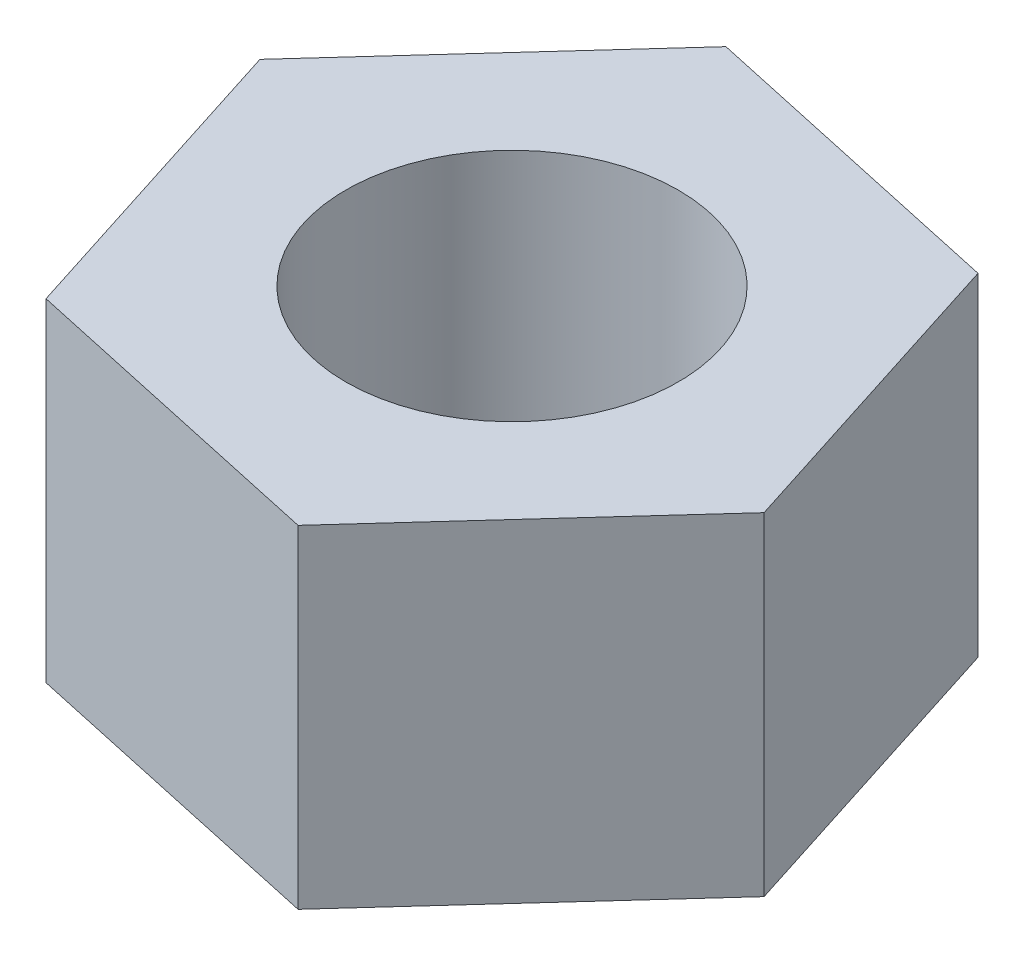
ISO-10303-21;
HEADER;
FILE_DESCRIPTION(('STEP AP214'),'2;1');
FILE_NAME('part.step','',(''),(''),'','','');
FILE_SCHEMA(('AUTOMOTIVE_DESIGN { 1 0 10303 214 1 1 1 1 }'));
ENDSEC;
DATA;
#1=APPLICATION_CONTEXT('core data for automotive mechanical design processes');
#2=APPLICATION_PROTOCOL_DEFINITION('international standard','automotive_design',2000,#1);
#3=PRODUCT_CONTEXT('',#1,'mechanical');
#4=PRODUCT('Part','Part','',(#3));
#5=PRODUCT_RELATED_PRODUCT_CATEGORY('part','',(#4));
#6=PRODUCT_DEFINITION_FORMATION('','',#4);
#7=PRODUCT_DEFINITION_CONTEXT('part definition',#1,'design');
#8=PRODUCT_DEFINITION('design','',#6,#7);
#9=PRODUCT_DEFINITION_SHAPE('','',#8);
#10=(LENGTH_UNIT() NAMED_UNIT(*) SI_UNIT(.MILLI.,.METRE.));
#11=(NAMED_UNIT(*) PLANE_ANGLE_UNIT() SI_UNIT($,.RADIAN.));
#12=(NAMED_UNIT(*) SI_UNIT($,.STERADIAN.) SOLID_ANGLE_UNIT());
#13=UNCERTAINTY_MEASURE_WITH_UNIT(LENGTH_MEASURE(1.E-05),#10,'distance_accuracy_value','');
#14=(GEOMETRIC_REPRESENTATION_CONTEXT(3) GLOBAL_UNCERTAINTY_ASSIGNED_CONTEXT((#13)) GLOBAL_UNIT_ASSIGNED_CONTEXT((#10,
#11,#12)) REPRESENTATION_CONTEXT('',''));
#15=CARTESIAN_POINT('',(0.,0.,0.));
#16=DIRECTION('',(0.,0.,1.));
#17=DIRECTION('',(1.,0.,0.));
#18=AXIS2_PLACEMENT_3D('',#15,#16,#17);
#19=CARTESIAN_POINT('',(0.,3.,0.));
#20=DIRECTION('',(0.,1.,0.));
#21=DIRECTION('',(0.,0.,1.));
#22=AXIS2_PLACEMENT_3D('',#19,#20,#21);
#23=PLANE('',#22);
#24=DIRECTION('',(0.97706444258888,0.,0.212943830688942));
#25=VECTOR('',#24,1.);
#26=CARTESIAN_POINT('',(-2.00265649097475,3.,2.20128246906799));
#27=LINE('',#26,#25);
#28=CARTESIAN_POINT('',(-2.00265649097475,3.,2.20128246906799));
#29=VERTEX_POINT('',#28);
#30=CARTESIAN_POINT('',(0.905038293630836,3.,2.83499263077193));
#31=VERTEX_POINT('',#30);
#32=EDGE_CURVE('E150',#29,#31,#27,.T.);
#33=ORIENTED_EDGE('',*,*,#32,.T.);
#34=DIRECTION('',(0.672946988250236,0.,-0.739690713071982));
#35=VECTOR('',#34,1.);
#36=CARTESIAN_POINT('',(0.905038293630836,3.,2.83499263077193));
#37=LINE('',#36,#35);
#38=CARTESIAN_POINT('',(2.90769478460559,3.,0.633710161703939));
#39=VERTEX_POINT('',#38);
#40=EDGE_CURVE('E98',#31,#39,#37,.T.);
#41=ORIENTED_EDGE('',*,*,#40,.T.);
#42=DIRECTION('',(-0.304117454338645,0.,-0.952634543760923));
#43=VECTOR('',#42,1.);
#44=CARTESIAN_POINT('',(2.90769478460559,3.,0.633710161703939));
#45=LINE('',#44,#43);
#46=CARTESIAN_POINT('',(2.00265649097475,3.,-2.20128246906799));
#47=VERTEX_POINT('',#46);
#48=EDGE_CURVE('E111',#39,#47,#45,.T.);
#49=ORIENTED_EDGE('',*,*,#48,.T.);
#50=DIRECTION('',(-0.97706444258888,0.,-0.212943830688942));
#51=VECTOR('',#50,1.);
#52=CARTESIAN_POINT('',(2.00265649097475,3.,-2.20128246906799));
#53=LINE('',#52,#51);
#54=CARTESIAN_POINT('',(-0.905038293630834,3.,-2.83499263077193));
#55=VERTEX_POINT('',#54);
#56=EDGE_CURVE('E105',#47,#55,#53,.T.);
#57=ORIENTED_EDGE('',*,*,#56,.T.);
#58=DIRECTION('',(-0.672946988250236,0.,0.739690713071982));
#59=VECTOR('',#58,1.);
#60=CARTESIAN_POINT('',(-0.905038293630834,3.,-2.83499263077193));
#61=LINE('',#60,#59);
#62=CARTESIAN_POINT('',(-2.90769478460559,3.,-0.63371016170394));
#63=VERTEX_POINT('',#62);
#64=EDGE_CURVE('E109',#55,#63,#61,.T.);
#65=ORIENTED_EDGE('',*,*,#64,.T.);
#66=DIRECTION('',(0.304117454338645,0.,0.952634543760923));
#67=VECTOR('',#66,1.);
#68=CARTESIAN_POINT('',(-2.90769478460559,3.,-0.63371016170394));
#69=LINE('',#68,#67);
#70=EDGE_CURVE('E61',#63,#29,#69,.T.);
#71=ORIENTED_EDGE('',*,*,#70,.T.);
#72=EDGE_LOOP('',(#33,#41,#49,#57,#65,#71));
#73=FACE_BOUND('',#72,.T.);
#74=CARTESIAN_POINT('',(0.,3.,0.));
#75=DIRECTION('',(0.,1.,0.));
#76=DIRECTION('',(0.,0.,1.));
#77=AXIS2_PLACEMENT_3D('',#74,#75,#76);
#78=CIRCLE('',#77,1.5);
#79=CARTESIAN_POINT('',(0.,3.,1.5));
#80=VERTEX_POINT('',#79);
#81=EDGE_CURVE('E138',#80,#80,#78,.T.);
#82=ORIENTED_EDGE('',*,*,#81,.F.);
#83=EDGE_LOOP('',(#82));
#84=FACE_BOUND('',#83,.T.);
#85=ADVANCED_FACE('F43',(#73,#84),#23,.T.);
#86=CARTESIAN_POINT('',(0.,0.,0.));
#87=DIRECTION('',(0.,1.,0.));
#88=DIRECTION('',(0.,0.,1.));
#89=AXIS2_PLACEMENT_3D('',#86,#87,#88);
#90=PLANE('',#89);
#91=DIRECTION('',(0.97706444258888,0.,0.212943830688942));
#92=VECTOR('',#91,1.);
#93=CARTESIAN_POINT('',(-2.00265649097475,0.,2.20128246906799));
#94=LINE('',#93,#92);
#95=CARTESIAN_POINT('',(-2.00265649097475,0.,2.20128246906799));
#96=VERTEX_POINT('',#95);
#97=CARTESIAN_POINT('',(0.905038293630836,0.,2.83499263077193));
#98=VERTEX_POINT('',#97);
#99=EDGE_CURVE('E133',#96,#98,#94,.T.);
#100=ORIENTED_EDGE('',*,*,#99,.F.);
#101=DIRECTION('',(0.304117454338645,0.,0.952634543760923));
#102=VECTOR('',#101,1.);
#103=CARTESIAN_POINT('',(-2.90769478460559,0.,-0.63371016170394));
#104=LINE('',#103,#102);
#105=CARTESIAN_POINT('',(-2.90769478460559,0.,-0.63371016170394));
#106=VERTEX_POINT('',#105);
#107=EDGE_CURVE('E90',#106,#96,#104,.T.);
#108=ORIENTED_EDGE('',*,*,#107,.F.);
#109=DIRECTION('',(-0.672946988250236,0.,0.739690713071982));
#110=VECTOR('',#109,1.);
#111=CARTESIAN_POINT('',(-0.905038293630834,0.,-2.83499263077193));
#112=LINE('',#111,#110);
#113=CARTESIAN_POINT('',(-0.905038293630834,0.,-2.83499263077193));
#114=VERTEX_POINT('',#113);
#115=EDGE_CURVE('E84',#114,#106,#112,.T.);
#116=ORIENTED_EDGE('',*,*,#115,.F.);
#117=DIRECTION('',(-0.97706444258888,0.,-0.212943830688942));
#118=VECTOR('',#117,1.);
#119=CARTESIAN_POINT('',(2.00265649097475,0.,-2.20128246906799));
#120=LINE('',#119,#118);
#121=CARTESIAN_POINT('',(2.00265649097475,0.,-2.20128246906799));
#122=VERTEX_POINT('',#121);
#123=EDGE_CURVE('E120',#122,#114,#120,.T.);
#124=ORIENTED_EDGE('',*,*,#123,.F.);
#125=DIRECTION('',(-0.304117454338645,0.,-0.952634543760923));
#126=VECTOR('',#125,1.);
#127=CARTESIAN_POINT('',(2.90769478460559,0.,0.633710161703939));
#128=LINE('',#127,#126);
#129=CARTESIAN_POINT('',(2.90769478460559,0.,0.633710161703939));
#130=VERTEX_POINT('',#129);
#131=EDGE_CURVE('E141',#130,#122,#128,.T.);
#132=ORIENTED_EDGE('',*,*,#131,.F.);
#133=DIRECTION('',(0.672946988250236,0.,-0.739690713071982));
#134=VECTOR('',#133,1.);
#135=CARTESIAN_POINT('',(0.905038293630836,0.,2.83499263077193));
#136=LINE('',#135,#134);
#137=EDGE_CURVE('E137',#98,#130,#136,.T.);
#138=ORIENTED_EDGE('',*,*,#137,.F.);
#139=EDGE_LOOP('',(#100,#108,#116,#124,#132,#138));
#140=FACE_BOUND('',#139,.T.);
#141=CARTESIAN_POINT('',(0.,0.,0.));
#142=DIRECTION('',(0.,1.,0.));
#143=DIRECTION('',(0.,0.,1.));
#144=AXIS2_PLACEMENT_3D('',#141,#142,#143);
#145=CIRCLE('',#144,1.5);
#146=CARTESIAN_POINT('',(0.,0.,1.5));
#147=VERTEX_POINT('',#146);
#148=EDGE_CURVE('E265',#147,#147,#145,.T.);
#149=ORIENTED_EDGE('',*,*,#148,.T.);
#150=EDGE_LOOP('',(#149));
#151=FACE_BOUND('',#150,.T.);
#152=ADVANCED_FACE('F163',(#140,#151),#90,.F.);
#153=CARTESIAN_POINT('',(-2.00265649097475,3.,2.20128246906799));
#154=DIRECTION('',(0.212943830688942,0.,-0.97706444258888));
#155=DIRECTION('',(-0.97706444258888,0.,-0.212943830688942));
#156=AXIS2_PLACEMENT_3D('',#153,#154,#155);
#157=PLANE('',#156);
#158=ORIENTED_EDGE('',*,*,#99,.T.);
#159=DIRECTION('',(0.,-1.,0.));
#160=VECTOR('',#159,1.);
#161=CARTESIAN_POINT('',(0.905038293630836,3.,2.83499263077193));
#162=LINE('',#161,#160);
#163=EDGE_CURVE('E11',#31,#98,#162,.T.);
#164=ORIENTED_EDGE('',*,*,#163,.F.);
#165=ORIENTED_EDGE('',*,*,#32,.F.);
#166=DIRECTION('',(0.,-1.,0.));
#167=VECTOR('',#166,1.);
#168=CARTESIAN_POINT('',(-2.00265649097475,3.,2.20128246906799));
#169=LINE('',#168,#167);
#170=EDGE_CURVE('E129',#29,#96,#169,.T.);
#171=ORIENTED_EDGE('',*,*,#170,.T.);
#172=EDGE_LOOP('',(#158,#164,#165,#171));
#173=FACE_BOUND('',#172,.T.);
#174=ADVANCED_FACE('F45',(#173),#157,.F.);
#175=CARTESIAN_POINT('',(0.905038293630836,3.,2.83499263077193));
#176=DIRECTION('',(-0.739690713071982,0.,-0.672946988250235));
#177=DIRECTION('',(-0.672946988250236,0.,0.739690713071982));
#178=AXIS2_PLACEMENT_3D('',#175,#176,#177);
#179=PLANE('',#178);
#180=ORIENTED_EDGE('',*,*,#137,.T.);
#181=DIRECTION('',(0.,-1.,0.));
#182=VECTOR('',#181,1.);
#183=CARTESIAN_POINT('',(2.90769478460559,3.,0.633710161703939));
#184=LINE('',#183,#182);
#185=EDGE_CURVE('E53',#39,#130,#184,.T.);
#186=ORIENTED_EDGE('',*,*,#185,.F.);
#187=ORIENTED_EDGE('',*,*,#40,.F.);
#188=ORIENTED_EDGE('',*,*,#163,.T.);
#189=EDGE_LOOP('',(#180,#186,#187,#188));
#190=FACE_BOUND('',#189,.T.);
#191=ADVANCED_FACE('F188',(#190),#179,.F.);
#192=CARTESIAN_POINT('',(2.90769478460559,3.,0.633710161703939));
#193=DIRECTION('',(-0.952634543760923,0.,0.304117454338645));
#194=DIRECTION('',(0.304117454338645,0.,0.952634543760923));
#195=AXIS2_PLACEMENT_3D('',#192,#193,#194);
#196=PLANE('',#195);
#197=ORIENTED_EDGE('',*,*,#131,.T.);
#198=DIRECTION('',(0.,-1.,0.));
#199=VECTOR('',#198,1.);
#200=CARTESIAN_POINT('',(2.00265649097475,3.,-2.20128246906799));
#201=LINE('',#200,#199);
#202=EDGE_CURVE('E122',#47,#122,#201,.T.);
#203=ORIENTED_EDGE('',*,*,#202,.F.);
#204=ORIENTED_EDGE('',*,*,#48,.F.);
#205=ORIENTED_EDGE('',*,*,#185,.T.);
#206=EDGE_LOOP('',(#197,#203,#204,#205));
#207=FACE_BOUND('',#206,.T.);
#208=ADVANCED_FACE('F160',(#207),#196,.F.);
#209=CARTESIAN_POINT('',(2.00265649097475,3.,-2.20128246906799));
#210=DIRECTION('',(-0.212943830688942,0.,0.97706444258888));
#211=DIRECTION('',(0.97706444258888,0.,0.212943830688942));
#212=AXIS2_PLACEMENT_3D('',#209,#210,#211);
#213=PLANE('',#212);
#214=ORIENTED_EDGE('',*,*,#123,.T.);
#215=DIRECTION('',(0.,-1.,0.));
#216=VECTOR('',#215,1.);
#217=CARTESIAN_POINT('',(-0.905038293630834,3.,-2.83499263077193));
#218=LINE('',#217,#216);
#219=EDGE_CURVE('E117',#55,#114,#218,.T.);
#220=ORIENTED_EDGE('',*,*,#219,.F.);
#221=ORIENTED_EDGE('',*,*,#56,.F.);
#222=ORIENTED_EDGE('',*,*,#202,.T.);
#223=EDGE_LOOP('',(#214,#220,#221,#222));
#224=FACE_BOUND('',#223,.T.);
#225=ADVANCED_FACE('F118',(#224),#213,.F.);
#226=CARTESIAN_POINT('',(-0.905038293630834,3.,-2.83499263077193));
#227=DIRECTION('',(0.739690713071982,0.,0.672946988250236));
#228=DIRECTION('',(0.672946988250236,0.,-0.739690713071982));
#229=AXIS2_PLACEMENT_3D('',#226,#227,#228);
#230=PLANE('',#229);
#231=ORIENTED_EDGE('',*,*,#115,.T.);
#232=DIRECTION('',(0.,-1.,0.));
#233=VECTOR('',#232,1.);
#234=CARTESIAN_POINT('',(-2.90769478460559,3.,-0.63371016170394));
#235=LINE('',#234,#233);
#236=EDGE_CURVE('E123',#63,#106,#235,.T.);
#237=ORIENTED_EDGE('',*,*,#236,.F.);
#238=ORIENTED_EDGE('',*,*,#64,.F.);
#239=ORIENTED_EDGE('',*,*,#219,.T.);
#240=EDGE_LOOP('',(#231,#237,#238,#239));
#241=FACE_BOUND('',#240,.T.);
#242=ADVANCED_FACE('F125',(#241),#230,.F.);
#243=CARTESIAN_POINT('',(-2.90769478460559,3.,-0.63371016170394));
#244=DIRECTION('',(0.952634543760923,0.,-0.304117454338645));
#245=DIRECTION('',(-0.304117454338645,0.,-0.952634543760923));
#246=AXIS2_PLACEMENT_3D('',#243,#244,#245);
#247=PLANE('',#246);
#248=ORIENTED_EDGE('',*,*,#107,.T.);
#249=ORIENTED_EDGE('',*,*,#170,.F.);
#250=ORIENTED_EDGE('',*,*,#70,.F.);
#251=ORIENTED_EDGE('',*,*,#236,.T.);
#252=EDGE_LOOP('',(#248,#249,#250,#251));
#253=FACE_BOUND('',#252,.T.);
#254=ADVANCED_FACE('F168',(#253),#247,.F.);
#255=CARTESIAN_POINT('',(0.,3.,0.));
#256=DIRECTION('',(0.,-1.,0.));
#257=DIRECTION('',(0.,0.,-1.));
#258=AXIS2_PLACEMENT_3D('',#255,#256,#257);
#259=CYLINDRICAL_SURFACE('',#258,1.5);
#260=ORIENTED_EDGE('',*,*,#81,.T.);
#261=EDGE_LOOP('',(#260));
#262=FACE_BOUND('',#261,.T.);
#263=ORIENTED_EDGE('',*,*,#148,.F.);
#264=EDGE_LOOP('',(#263));
#265=FACE_BOUND('',#264,.T.);
#266=ADVANCED_FACE('F170',(#262,#265),#259,.F.);
#267=CLOSED_SHELL('',(#85,#152,#174,#191,#208,#225,#242,#254,#266));
#268=MANIFOLD_SOLID_BREP('B2',#267);
#269=ADVANCED_BREP_SHAPE_REPRESENTATION('',(#18,#268),#14);
#270=SHAPE_DEFINITION_REPRESENTATION(#9,#269);
ENDSEC;
END-ISO-10303-21;
